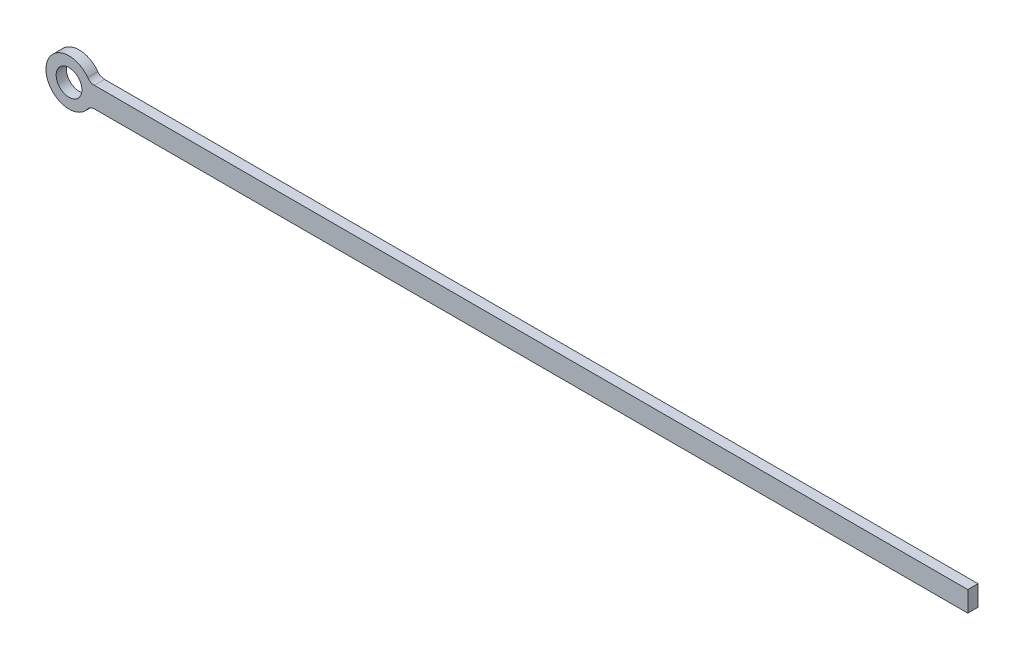
ISO-10303-21;
HEADER;
FILE_DESCRIPTION(('STEP AP214'),'2;1');
FILE_NAME('part.step','',(''),(''),'','','');
FILE_SCHEMA(('AUTOMOTIVE_DESIGN { 1 0 10303 214 1 1 1 1 }'));
ENDSEC;
DATA;
#1=APPLICATION_CONTEXT('core data for automotive mechanical design processes');
#2=APPLICATION_PROTOCOL_DEFINITION('international standard','automotive_design',2000,#1);
#3=PRODUCT_CONTEXT('',#1,'mechanical');
#4=PRODUCT('Part','Part','',(#3));
#5=PRODUCT_RELATED_PRODUCT_CATEGORY('part','',(#4));
#6=PRODUCT_DEFINITION_FORMATION('','',#4);
#7=PRODUCT_DEFINITION_CONTEXT('part definition',#1,'design');
#8=PRODUCT_DEFINITION('design','',#6,#7);
#9=PRODUCT_DEFINITION_SHAPE('','',#8);
#10=(LENGTH_UNIT() NAMED_UNIT(*) SI_UNIT(.MILLI.,.METRE.));
#11=(NAMED_UNIT(*) PLANE_ANGLE_UNIT() SI_UNIT($,.RADIAN.));
#12=(NAMED_UNIT(*) SI_UNIT($,.STERADIAN.) SOLID_ANGLE_UNIT());
#13=UNCERTAINTY_MEASURE_WITH_UNIT(LENGTH_MEASURE(1.E-05),#10,'distance_accuracy_value','');
#14=(GEOMETRIC_REPRESENTATION_CONTEXT(3) GLOBAL_UNCERTAINTY_ASSIGNED_CONTEXT((#13)) GLOBAL_UNIT_ASSIGNED_CONTEXT((#10,
#11,#12)) REPRESENTATION_CONTEXT('',''));
#15=CARTESIAN_POINT('',(0.,0.,0.));
#16=DIRECTION('',(0.,0.,1.));
#17=DIRECTION('',(1.,0.,0.));
#18=AXIS2_PLACEMENT_3D('',#15,#16,#17);
#19=CARTESIAN_POINT('',(7.85620773656094,-5.715,3.175));
#20=DIRECTION('',(0.,0.,1.));
#21=DIRECTION('',(1.,0.,0.));
#22=AXIS2_PLACEMENT_3D('',#19,#20,#21);
#23=PLANE('',#22);
#24=CARTESIAN_POINT('',(7.85620773656094,-5.715,3.175));
#25=DIRECTION('',(0.,0.,-1.));
#26=DIRECTION('',(1.,0.,0.));
#27=AXIS2_PLACEMENT_3D('',#24,#25,#26);
#28=CIRCLE('',#27,2.54);
#29=CARTESIAN_POINT('',(5.80219150898865,-4.22080545548121,3.175));
#30=VERTEX_POINT('',#29);
#31=CARTESIAN_POINT('',(7.85620773656094,-3.175,3.175));
#32=VERTEX_POINT('',#31);
#33=EDGE_CURVE('E135',#30,#32,#28,.T.);
#34=ORIENTED_EDGE('',*,*,#33,.T.);
#35=DIRECTION('',(1.,0.,0.));
#36=VECTOR('',#35,1.);
#37=CARTESIAN_POINT('',(279.4,-3.175,3.175));
#38=LINE('',#37,#36);
#39=CARTESIAN_POINT('',(279.4,-3.175,3.175));
#40=VERTEX_POINT('',#39);
#41=EDGE_CURVE('E93',#32,#40,#38,.T.);
#42=ORIENTED_EDGE('',*,*,#41,.T.);
#43=DIRECTION('',(0.,1.,0.));
#44=VECTOR('',#43,1.);
#45=CARTESIAN_POINT('',(279.4,3.175,3.175));
#46=LINE('',#45,#44);
#47=CARTESIAN_POINT('',(279.4,3.175,3.175));
#48=VERTEX_POINT('',#47);
#49=EDGE_CURVE('E106',#40,#48,#46,.T.);
#50=ORIENTED_EDGE('',*,*,#49,.T.);
#51=DIRECTION('',(-1.,0.,0.));
#52=VECTOR('',#51,1.);
#53=CARTESIAN_POINT('',(7.85620773656094,3.175,3.175));
#54=LINE('',#53,#52);
#55=CARTESIAN_POINT('',(7.85620773656094,3.175,3.175));
#56=VERTEX_POINT('',#55);
#57=EDGE_CURVE('E100',#48,#56,#54,.T.);
#58=ORIENTED_EDGE('',*,*,#57,.T.);
#59=CARTESIAN_POINT('',(7.85620773656094,5.715,3.175));
#60=DIRECTION('',(0.,0.,-1.));
#61=DIRECTION('',(-1.,0.,0.));
#62=AXIS2_PLACEMENT_3D('',#59,#60,#61);
#63=CIRCLE('',#62,2.54);
#64=CARTESIAN_POINT('',(5.80219150898865,4.22080545548121,3.175));
#65=VERTEX_POINT('',#64);
#66=EDGE_CURVE('E104',#56,#65,#63,.T.);
#67=ORIENTED_EDGE('',*,*,#66,.T.);
#68=CARTESIAN_POINT('',(0.,0.,3.175));
#69=DIRECTION('',(0.,0.,1.));
#70=DIRECTION('',(1.,0.,0.));
#71=AXIS2_PLACEMENT_3D('',#68,#69,#70);
#72=CIRCLE('',#71,7.175);
#73=EDGE_CURVE('E56',#65,#30,#72,.T.);
#74=ORIENTED_EDGE('',*,*,#73,.T.);
#75=EDGE_LOOP('',(#34,#42,#50,#58,#67,#74));
#76=FACE_BOUND('',#75,.T.);
#77=CARTESIAN_POINT('',(0.,0.,3.175));
#78=DIRECTION('',(0.,0.,1.));
#79=DIRECTION('',(1.,0.,0.));
#80=AXIS2_PLACEMENT_3D('',#77,#78,#79);
#81=CIRCLE('',#80,4.);
#82=CARTESIAN_POINT('',(4.,0.,3.175));
#83=VERTEX_POINT('',#82);
#84=EDGE_CURVE('E128',#83,#83,#81,.T.);
#85=ORIENTED_EDGE('',*,*,#84,.F.);
#86=EDGE_LOOP('',(#85));
#87=FACE_BOUND('',#86,.T.);
#88=ADVANCED_FACE('F39',(#76,#87),#23,.T.);
#89=CARTESIAN_POINT('',(7.85620773656094,-5.715,0.));
#90=DIRECTION('',(0.,0.,1.));
#91=DIRECTION('',(1.,0.,0.));
#92=AXIS2_PLACEMENT_3D('',#89,#90,#91);
#93=PLANE('',#92);
#94=CARTESIAN_POINT('',(7.85620773656094,-5.715,0.));
#95=DIRECTION('',(0.,0.,-1.));
#96=DIRECTION('',(1.,0.,0.));
#97=AXIS2_PLACEMENT_3D('',#94,#95,#96);
#98=CIRCLE('',#97,2.54);
#99=CARTESIAN_POINT('',(5.80219150898865,-4.22080545548121,0.));
#100=VERTEX_POINT('',#99);
#101=CARTESIAN_POINT('',(7.85620773656094,-3.175,0.));
#102=VERTEX_POINT('',#101);
#103=EDGE_CURVE('E124',#100,#102,#98,.T.);
#104=ORIENTED_EDGE('',*,*,#103,.F.);
#105=CARTESIAN_POINT('',(0.,0.,0.));
#106=DIRECTION('',(0.,0.,1.));
#107=DIRECTION('',(1.,0.,0.));
#108=AXIS2_PLACEMENT_3D('',#105,#106,#107);
#109=CIRCLE('',#108,7.175);
#110=CARTESIAN_POINT('',(5.80219150898865,4.22080545548121,0.));
#111=VERTEX_POINT('',#110);
#112=EDGE_CURVE('E85',#111,#100,#109,.T.);
#113=ORIENTED_EDGE('',*,*,#112,.F.);
#114=CARTESIAN_POINT('',(7.85620773656094,5.715,0.));
#115=DIRECTION('',(0.,0.,-1.));
#116=DIRECTION('',(-1.,0.,0.));
#117=AXIS2_PLACEMENT_3D('',#114,#115,#116);
#118=CIRCLE('',#117,2.54);
#119=CARTESIAN_POINT('',(7.85620773656094,3.175,0.));
#120=VERTEX_POINT('',#119);
#121=EDGE_CURVE('E79',#120,#111,#118,.T.);
#122=ORIENTED_EDGE('',*,*,#121,.F.);
#123=DIRECTION('',(-1.,0.,0.));
#124=VECTOR('',#123,1.);
#125=CARTESIAN_POINT('',(7.85620773656094,3.175,0.));
#126=LINE('',#125,#124);
#127=CARTESIAN_POINT('',(279.4,3.175,0.));
#128=VERTEX_POINT('',#127);
#129=EDGE_CURVE('E114',#128,#120,#126,.T.);
#130=ORIENTED_EDGE('',*,*,#129,.F.);
#131=DIRECTION('',(0.,1.,0.));
#132=VECTOR('',#131,1.);
#133=CARTESIAN_POINT('',(279.4,3.175,0.));
#134=LINE('',#133,#132);
#135=CARTESIAN_POINT('',(279.4,-3.175,0.));
#136=VERTEX_POINT('',#135);
#137=EDGE_CURVE('E130',#136,#128,#134,.T.);
#138=ORIENTED_EDGE('',*,*,#137,.F.);
#139=DIRECTION('',(1.,0.,0.));
#140=VECTOR('',#139,1.);
#141=CARTESIAN_POINT('',(279.4,-3.175,0.));
#142=LINE('',#141,#140);
#143=EDGE_CURVE('E127',#102,#136,#142,.T.);
#144=ORIENTED_EDGE('',*,*,#143,.F.);
#145=EDGE_LOOP('',(#104,#113,#122,#130,#138,#144));
#146=FACE_BOUND('',#145,.T.);
#147=CARTESIAN_POINT('',(0.,0.,0.));
#148=DIRECTION('',(0.,0.,1.));
#149=DIRECTION('',(1.,0.,0.));
#150=AXIS2_PLACEMENT_3D('',#147,#148,#149);
#151=CIRCLE('',#150,4.);
#152=CARTESIAN_POINT('',(4.,0.,0.));
#153=VERTEX_POINT('',#152);
#154=EDGE_CURVE('E228',#153,#153,#151,.T.);
#155=ORIENTED_EDGE('',*,*,#154,.T.);
#156=EDGE_LOOP('',(#155));
#157=FACE_BOUND('',#156,.T.);
#158=ADVANCED_FACE('F144',(#146,#157),#93,.F.);
#159=CARTESIAN_POINT('',(7.85620773656094,-5.715,3.175));
#160=DIRECTION('',(0.,0.,-1.));
#161=DIRECTION('',(-1.,0.,0.));
#162=AXIS2_PLACEMENT_3D('',#159,#160,#161);
#163=CYLINDRICAL_SURFACE('',#162,2.54);
#164=ORIENTED_EDGE('',*,*,#103,.T.);
#165=DIRECTION('',(0.,0.,-1.));
#166=VECTOR('',#165,1.);
#167=CARTESIAN_POINT('',(7.85620773656094,-3.175,3.175));
#168=LINE('',#167,#166);
#169=EDGE_CURVE('E11',#32,#102,#168,.T.);
#170=ORIENTED_EDGE('',*,*,#169,.F.);
#171=ORIENTED_EDGE('',*,*,#33,.F.);
#172=DIRECTION('',(0.,0.,-1.));
#173=VECTOR('',#172,1.);
#174=CARTESIAN_POINT('',(5.80219150898865,-4.22080545548121,3.175));
#175=LINE('',#174,#173);
#176=EDGE_CURVE('E120',#30,#100,#175,.T.);
#177=ORIENTED_EDGE('',*,*,#176,.T.);
#178=EDGE_LOOP('',(#164,#170,#171,#177));
#179=FACE_BOUND('',#178,.T.);
#180=ADVANCED_FACE('F41',(#179),#163,.F.);
#181=CARTESIAN_POINT('',(279.4,-3.175,3.175));
#182=DIRECTION('',(0.,1.,0.));
#183=DIRECTION('',(0.,0.,1.));
#184=AXIS2_PLACEMENT_3D('',#181,#182,#183);
#185=PLANE('',#184);
#186=ORIENTED_EDGE('',*,*,#143,.T.);
#187=DIRECTION('',(0.,0.,-1.));
#188=VECTOR('',#187,1.);
#189=CARTESIAN_POINT('',(279.4,-3.175,3.175));
#190=LINE('',#189,#188);
#191=EDGE_CURVE('E48',#40,#136,#190,.T.);
#192=ORIENTED_EDGE('',*,*,#191,.F.);
#193=ORIENTED_EDGE('',*,*,#41,.F.);
#194=ORIENTED_EDGE('',*,*,#169,.T.);
#195=EDGE_LOOP('',(#186,#192,#193,#194));
#196=FACE_BOUND('',#195,.T.);
#197=ADVANCED_FACE('F169',(#196),#185,.F.);
#198=CARTESIAN_POINT('',(279.4,3.175,3.175));
#199=DIRECTION('',(-1.,0.,0.));
#200=DIRECTION('',(0.,0.,1.));
#201=AXIS2_PLACEMENT_3D('',#198,#199,#200);
#202=PLANE('',#201);
#203=ORIENTED_EDGE('',*,*,#137,.T.);
#204=DIRECTION('',(0.,0.,-1.));
#205=VECTOR('',#204,1.);
#206=CARTESIAN_POINT('',(279.4,3.175,3.175));
#207=LINE('',#206,#205);
#208=EDGE_CURVE('E115',#48,#128,#207,.T.);
#209=ORIENTED_EDGE('',*,*,#208,.F.);
#210=ORIENTED_EDGE('',*,*,#49,.F.);
#211=ORIENTED_EDGE('',*,*,#191,.T.);
#212=EDGE_LOOP('',(#203,#209,#210,#211));
#213=FACE_BOUND('',#212,.T.);
#214=ADVANCED_FACE('F141',(#213),#202,.F.);
#215=CARTESIAN_POINT('',(7.85620773656094,3.175,3.175));
#216=DIRECTION('',(0.,-1.,0.));
#217=DIRECTION('',(0.,0.,-1.));
#218=AXIS2_PLACEMENT_3D('',#215,#216,#217);
#219=PLANE('',#218);
#220=ORIENTED_EDGE('',*,*,#129,.T.);
#221=DIRECTION('',(0.,0.,-1.));
#222=VECTOR('',#221,1.);
#223=CARTESIAN_POINT('',(7.85620773656094,3.175,3.175));
#224=LINE('',#223,#222);
#225=EDGE_CURVE('E111',#56,#120,#224,.T.);
#226=ORIENTED_EDGE('',*,*,#225,.F.);
#227=ORIENTED_EDGE('',*,*,#57,.F.);
#228=ORIENTED_EDGE('',*,*,#208,.T.);
#229=EDGE_LOOP('',(#220,#226,#227,#228));
#230=FACE_BOUND('',#229,.T.);
#231=ADVANCED_FACE('F112',(#230),#219,.F.);
#232=CARTESIAN_POINT('',(7.85620773656094,5.715,3.175));
#233=DIRECTION('',(0.,0.,-1.));
#234=DIRECTION('',(-1.,0.,0.));
#235=AXIS2_PLACEMENT_3D('',#232,#233,#234);
#236=CYLINDRICAL_SURFACE('',#235,2.54);
#237=ORIENTED_EDGE('',*,*,#121,.T.);
#238=DIRECTION('',(0.,0.,-1.));
#239=VECTOR('',#238,1.);
#240=CARTESIAN_POINT('',(5.80219150898865,4.22080545548121,3.175));
#241=LINE('',#240,#239);
#242=EDGE_CURVE('E116',#65,#111,#241,.T.);
#243=ORIENTED_EDGE('',*,*,#242,.F.);
#244=ORIENTED_EDGE('',*,*,#66,.F.);
#245=ORIENTED_EDGE('',*,*,#225,.T.);
#246=EDGE_LOOP('',(#237,#243,#244,#245));
#247=FACE_BOUND('',#246,.T.);
#248=ADVANCED_FACE('F118',(#247),#236,.F.);
#249=CARTESIAN_POINT('',(0.,0.,3.175));
#250=DIRECTION('',(0.,0.,-1.));
#251=DIRECTION('',(-1.,0.,0.));
#252=AXIS2_PLACEMENT_3D('',#249,#250,#251);
#253=CYLINDRICAL_SURFACE('',#252,7.175);
#254=ORIENTED_EDGE('',*,*,#112,.T.);
#255=ORIENTED_EDGE('',*,*,#176,.F.);
#256=ORIENTED_EDGE('',*,*,#73,.F.);
#257=ORIENTED_EDGE('',*,*,#242,.T.);
#258=EDGE_LOOP('',(#254,#255,#256,#257));
#259=FACE_BOUND('',#258,.T.);
#260=ADVANCED_FACE('F149',(#259),#253,.T.);
#261=CARTESIAN_POINT('',(0.,0.,3.175));
#262=DIRECTION('',(0.,0.,-1.));
#263=DIRECTION('',(-1.,0.,0.));
#264=AXIS2_PLACEMENT_3D('',#261,#262,#263);
#265=CYLINDRICAL_SURFACE('',#264,4.);
#266=ORIENTED_EDGE('',*,*,#84,.T.);
#267=EDGE_LOOP('',(#266));
#268=FACE_BOUND('',#267,.T.);
#269=ORIENTED_EDGE('',*,*,#154,.F.);
#270=EDGE_LOOP('',(#269));
#271=FACE_BOUND('',#270,.T.);
#272=ADVANCED_FACE('F151',(#268,#271),#265,.F.);
#273=CLOSED_SHELL('',(#88,#158,#180,#197,#214,#231,#248,#260,#272));
#274=MANIFOLD_SOLID_BREP('B2',#273);
#275=ADVANCED_BREP_SHAPE_REPRESENTATION('',(#18,#274),#14);
#276=SHAPE_DEFINITION_REPRESENTATION(#9,#275);
ENDSEC;
END-ISO-10303-21;
